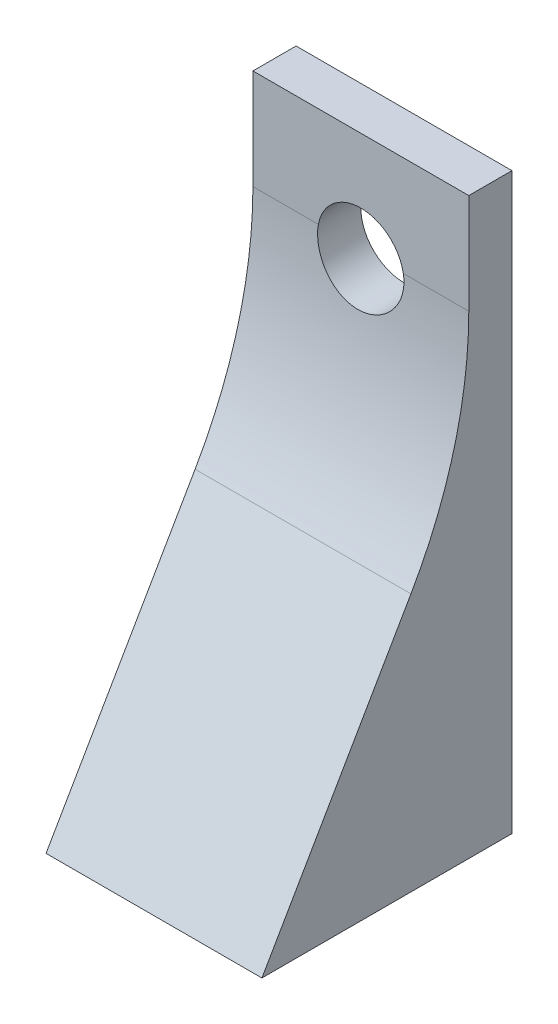
ISO-10303-21;
HEADER;
FILE_DESCRIPTION(('STEP AP214'),'2;1');
FILE_NAME('part.step','',(''),(''),'','','');
FILE_SCHEMA(('AUTOMOTIVE_DESIGN { 1 0 10303 214 1 1 1 1 }'));
ENDSEC;
DATA;
#1=APPLICATION_CONTEXT('core data for automotive mechanical design processes');
#2=APPLICATION_PROTOCOL_DEFINITION('international standard','automotive_design',2000,#1);
#3=PRODUCT_CONTEXT('',#1,'mechanical');
#4=PRODUCT('Part','Part','',(#3));
#5=PRODUCT_RELATED_PRODUCT_CATEGORY('part','',(#4));
#6=PRODUCT_DEFINITION_FORMATION('','',#4);
#7=PRODUCT_DEFINITION_CONTEXT('part definition',#1,'design');
#8=PRODUCT_DEFINITION('design','',#6,#7);
#9=PRODUCT_DEFINITION_SHAPE('','',#8);
#10=(LENGTH_UNIT() NAMED_UNIT(*) SI_UNIT(.MILLI.,.METRE.));
#11=(NAMED_UNIT(*) PLANE_ANGLE_UNIT() SI_UNIT($,.RADIAN.));
#12=(NAMED_UNIT(*) SI_UNIT($,.STERADIAN.) SOLID_ANGLE_UNIT());
#13=UNCERTAINTY_MEASURE_WITH_UNIT(LENGTH_MEASURE(1.E-05),#10,'distance_accuracy_value','');
#14=(GEOMETRIC_REPRESENTATION_CONTEXT(3) GLOBAL_UNCERTAINTY_ASSIGNED_CONTEXT((#13)) GLOBAL_UNIT_ASSIGNED_CONTEXT((#10,
#11,#12)) REPRESENTATION_CONTEXT('',''));
#15=CARTESIAN_POINT('',(0.,0.,0.));
#16=DIRECTION('',(0.,0.,1.));
#17=DIRECTION('',(1.,0.,0.));
#18=AXIS2_PLACEMENT_3D('',#15,#16,#17);
#19=CARTESIAN_POINT('',(0.,0.,1.));
#20=DIRECTION('',(0.,0.,1.));
#21=DIRECTION('',(1.,0.,0.));
#22=AXIS2_PLACEMENT_3D('',#19,#20,#21);
#23=PLANE('',#22);
#24=DIRECTION('',(0.,-1.,0.));
#25=VECTOR('',#24,1.);
#26=CARTESIAN_POINT('',(-2.5,6.65,1.));
#27=LINE('',#26,#25);
#28=CARTESIAN_POINT('',(-2.5,6.65,1.));
#29=VERTEX_POINT('',#28);
#30=CARTESIAN_POINT('',(-2.5,4.32949192431126,1.));
#31=VERTEX_POINT('',#30);
#32=EDGE_CURVE('E116',#29,#31,#27,.T.);
#33=ORIENTED_EDGE('',*,*,#32,.T.);
#34=DIRECTION('',(-1.,0.,0.));
#35=VECTOR('',#34,1.);
#36=CARTESIAN_POINT('',(0.,4.32949192431126,1.));
#37=LINE('',#36,#35);
#38=CARTESIAN_POINT('',(-0.983759446768897,4.32949192431126,1.));
#39=VERTEX_POINT('',#38);
#40=EDGE_CURVE('E51',#31,#39,#37,.F.);
#41=ORIENTED_EDGE('',*,*,#40,.T.);
#42=CARTESIAN_POINT('',(0.,4.15,1.));
#43=DIRECTION('',(0.,0.,1.));
#44=DIRECTION('',(1.,0.,0.));
#45=AXIS2_PLACEMENT_3D('',#42,#43,#44);
#46=CIRCLE('',#45,1.);
#47=CARTESIAN_POINT('',(0.983759446768894,4.32949192431126,1.));
#48=VERTEX_POINT('',#47);
#49=EDGE_CURVE('E124',#48,#39,#46,.T.);
#50=ORIENTED_EDGE('',*,*,#49,.F.);
#51=DIRECTION('',(-1.,0.,0.));
#52=VECTOR('',#51,1.);
#53=CARTESIAN_POINT('',(0.,4.32949192431126,1.));
#54=LINE('',#53,#52);
#55=CARTESIAN_POINT('',(2.5,4.32949192431126,1.));
#56=VERTEX_POINT('',#55);
#57=EDGE_CURVE('E150',#48,#56,#54,.F.);
#58=ORIENTED_EDGE('',*,*,#57,.T.);
#59=DIRECTION('',(0.,1.,0.));
#60=VECTOR('',#59,1.);
#61=CARTESIAN_POINT('',(2.5,6.65,1.));
#62=LINE('',#61,#60);
#63=CARTESIAN_POINT('',(2.5,6.65,1.));
#64=VERTEX_POINT('',#63);
#65=EDGE_CURVE('E130',#56,#64,#62,.T.);
#66=ORIENTED_EDGE('',*,*,#65,.T.);
#67=DIRECTION('',(-1.,0.,0.));
#68=VECTOR('',#67,1.);
#69=CARTESIAN_POINT('',(-2.5,6.65,1.));
#70=LINE('',#69,#68);
#71=EDGE_CURVE('E132',#64,#29,#70,.T.);
#72=ORIENTED_EDGE('',*,*,#71,.T.);
#73=EDGE_LOOP('',(#33,#41,#50,#58,#66,#72));
#74=FACE_BOUND('',#73,.T.);
#75=ADVANCED_FACE('F35',(#74),#23,.T.);
#76=CARTESIAN_POINT('',(0.,0.,0.));
#77=DIRECTION('',(0.,0.,1.));
#78=DIRECTION('',(1.,0.,0.));
#79=AXIS2_PLACEMENT_3D('',#76,#77,#78);
#80=PLANE('',#79);
#81=DIRECTION('',(0.,1.,0.));
#82=VECTOR('',#81,1.);
#83=CARTESIAN_POINT('',(2.5,6.65,0.));
#84=LINE('',#83,#82);
#85=CARTESIAN_POINT('',(2.5,-6.65,0.));
#86=VERTEX_POINT('',#85);
#87=CARTESIAN_POINT('',(2.5,6.65,0.));
#88=VERTEX_POINT('',#87);
#89=EDGE_CURVE('E128',#86,#88,#84,.T.);
#90=ORIENTED_EDGE('',*,*,#89,.F.);
#91=DIRECTION('',(1.,0.,0.));
#92=VECTOR('',#91,1.);
#93=CARTESIAN_POINT('',(-2.5,-6.65,0.));
#94=LINE('',#93,#92);
#95=CARTESIAN_POINT('',(-2.5,-6.65,0.));
#96=VERTEX_POINT('',#95);
#97=EDGE_CURVE('E114',#96,#86,#94,.T.);
#98=ORIENTED_EDGE('',*,*,#97,.F.);
#99=DIRECTION('',(0.,-1.,0.));
#100=VECTOR('',#99,1.);
#101=CARTESIAN_POINT('',(-2.5,6.65,0.));
#102=LINE('',#101,#100);
#103=CARTESIAN_POINT('',(-2.5,6.65,0.));
#104=VERTEX_POINT('',#103);
#105=EDGE_CURVE('E138',#104,#96,#102,.T.);
#106=ORIENTED_EDGE('',*,*,#105,.F.);
#107=DIRECTION('',(-1.,0.,0.));
#108=VECTOR('',#107,1.);
#109=CARTESIAN_POINT('',(-2.5,6.65,0.));
#110=LINE('',#109,#108);
#111=EDGE_CURVE('E136',#88,#104,#110,.T.);
#112=ORIENTED_EDGE('',*,*,#111,.F.);
#113=EDGE_LOOP('',(#90,#98,#106,#112));
#114=FACE_BOUND('',#113,.T.);
#115=CARTESIAN_POINT('',(0.,4.15,0.));
#116=DIRECTION('',(0.,0.,1.));
#117=DIRECTION('',(1.,0.,0.));
#118=AXIS2_PLACEMENT_3D('',#115,#116,#117);
#119=CIRCLE('',#118,1.);
#120=CARTESIAN_POINT('',(0.999999999999998,4.15,0.));
#121=VERTEX_POINT('',#120);
#122=EDGE_CURVE('E121',#121,#121,#119,.T.);
#123=ORIENTED_EDGE('',*,*,#122,.T.);
#124=EDGE_LOOP('',(#123));
#125=FACE_BOUND('',#124,.T.);
#126=ADVANCED_FACE('F165',(#114,#125),#80,.F.);
#127=CARTESIAN_POINT('',(2.5,6.65,1.));
#128=DIRECTION('',(-1.,0.,0.));
#129=DIRECTION('',(0.,-1.,0.));
#130=AXIS2_PLACEMENT_3D('',#127,#128,#129);
#131=PLANE('',#130);
#132=ORIENTED_EDGE('',*,*,#89,.T.);
#133=DIRECTION('',(0.,0.,-1.));
#134=VECTOR('',#133,1.);
#135=CARTESIAN_POINT('',(2.5,6.65,1.));
#136=LINE('',#135,#134);
#137=EDGE_CURVE('E145',#64,#88,#136,.T.);
#138=ORIENTED_EDGE('',*,*,#137,.F.);
#139=ORIENTED_EDGE('',*,*,#65,.F.);
#140=CARTESIAN_POINT('',(2.5,4.32949192431126,11.));
#141=DIRECTION('',(-1.,0.,0.));
#142=DIRECTION('',(0.,-1.,0.));
#143=AXIS2_PLACEMENT_3D('',#140,#141,#142);
#144=CIRCLE('',#143,10.);
#145=CARTESIAN_POINT('',(2.5,-0.670508075688783,2.33974596215564));
#146=VERTEX_POINT('',#145);
#147=EDGE_CURVE('E11',#56,#146,#144,.T.);
#148=ORIENTED_EDGE('',*,*,#147,.T.);
#149=DIRECTION('',(0.,-0.866025403784436,0.500000000000004));
#150=VECTOR('',#149,1.);
#151=CARTESIAN_POINT('',(2.5,1.65,1.));
#152=LINE('',#151,#150);
#153=CARTESIAN_POINT('',(2.5,-6.65,5.79200723427395));
#154=VERTEX_POINT('',#153);
#155=EDGE_CURVE('E94',#146,#154,#152,.T.);
#156=ORIENTED_EDGE('',*,*,#155,.T.);
#157=DIRECTION('',(0.,0.,-1.));
#158=VECTOR('',#157,1.);
#159=CARTESIAN_POINT('',(2.5,-6.65,1.));
#160=LINE('',#159,#158);
#161=EDGE_CURVE('E98',#154,#86,#160,.T.);
#162=ORIENTED_EDGE('',*,*,#161,.T.);
#163=EDGE_LOOP('',(#132,#138,#139,#148,#156,#162));
#164=FACE_BOUND('',#163,.T.);
#165=ADVANCED_FACE('F97',(#164),#131,.F.);
#166=CARTESIAN_POINT('',(-2.5,6.65,1.));
#167=DIRECTION('',(0.,-1.,0.));
#168=DIRECTION('',(0.,0.,-1.));
#169=AXIS2_PLACEMENT_3D('',#166,#167,#168);
#170=PLANE('',#169);
#171=ORIENTED_EDGE('',*,*,#111,.T.);
#172=DIRECTION('',(0.,0.,-1.));
#173=VECTOR('',#172,1.);
#174=CARTESIAN_POINT('',(-2.5,6.65,1.));
#175=LINE('',#174,#173);
#176=EDGE_CURVE('E142',#29,#104,#175,.T.);
#177=ORIENTED_EDGE('',*,*,#176,.F.);
#178=ORIENTED_EDGE('',*,*,#71,.F.);
#179=ORIENTED_EDGE('',*,*,#137,.T.);
#180=EDGE_LOOP('',(#171,#177,#178,#179));
#181=FACE_BOUND('',#180,.T.);
#182=ADVANCED_FACE('F174',(#181),#170,.F.);
#183=CARTESIAN_POINT('',(-2.5,6.65,1.));
#184=DIRECTION('',(1.,0.,0.));
#185=DIRECTION('',(0.,1.,0.));
#186=AXIS2_PLACEMENT_3D('',#183,#184,#185);
#187=PLANE('',#186);
#188=ORIENTED_EDGE('',*,*,#105,.T.);
#189=DIRECTION('',(0.,0.,-1.));
#190=VECTOR('',#189,1.);
#191=CARTESIAN_POINT('',(-2.5,-6.65,1.));
#192=LINE('',#191,#190);
#193=CARTESIAN_POINT('',(-2.5,-6.65,5.79200723427395));
#194=VERTEX_POINT('',#193);
#195=EDGE_CURVE('E115',#194,#96,#192,.T.);
#196=ORIENTED_EDGE('',*,*,#195,.F.);
#197=DIRECTION('',(0.,-0.866025403784436,0.500000000000004));
#198=VECTOR('',#197,1.);
#199=CARTESIAN_POINT('',(-2.5,1.65,1.));
#200=LINE('',#199,#198);
#201=CARTESIAN_POINT('',(-2.5,-0.670508075688783,2.33974596215564));
#202=VERTEX_POINT('',#201);
#203=EDGE_CURVE('E107',#202,#194,#200,.T.);
#204=ORIENTED_EDGE('',*,*,#203,.F.);
#205=CARTESIAN_POINT('',(-2.5,4.32949192431126,11.));
#206=DIRECTION('',(1.,0.,0.));
#207=DIRECTION('',(0.,1.,0.));
#208=AXIS2_PLACEMENT_3D('',#205,#206,#207);
#209=CIRCLE('',#208,10.);
#210=EDGE_CURVE('E153',#202,#31,#209,.T.);
#211=ORIENTED_EDGE('',*,*,#210,.T.);
#212=ORIENTED_EDGE('',*,*,#32,.F.);
#213=ORIENTED_EDGE('',*,*,#176,.T.);
#214=EDGE_LOOP('',(#188,#196,#204,#211,#212,#213));
#215=FACE_BOUND('',#214,.T.);
#216=ADVANCED_FACE('F171',(#215),#187,.F.);
#217=CARTESIAN_POINT('',(-2.5,-6.65,1.));
#218=DIRECTION('',(0.,1.,0.));
#219=DIRECTION('',(0.,0.,1.));
#220=AXIS2_PLACEMENT_3D('',#217,#218,#219);
#221=PLANE('',#220);
#222=ORIENTED_EDGE('',*,*,#97,.T.);
#223=ORIENTED_EDGE('',*,*,#161,.F.);
#224=DIRECTION('',(-1.,0.,0.));
#225=VECTOR('',#224,1.);
#226=CARTESIAN_POINT('',(2.5,-6.65,5.79200723427395));
#227=LINE('',#226,#225);
#228=EDGE_CURVE('E106',#154,#194,#227,.T.);
#229=ORIENTED_EDGE('',*,*,#228,.T.);
#230=ORIENTED_EDGE('',*,*,#195,.T.);
#231=EDGE_LOOP('',(#222,#223,#229,#230));
#232=FACE_BOUND('',#231,.T.);
#233=ADVANCED_FACE('F111',(#232),#221,.F.);
#234=CARTESIAN_POINT('',(0.,4.15,1.));
#235=DIRECTION('',(0.,0.,-1.));
#236=DIRECTION('',(-1.,0.,0.));
#237=AXIS2_PLACEMENT_3D('',#234,#235,#236);
#238=CYLINDRICAL_SURFACE('',#237,1.);
#239=ORIENTED_EDGE('',*,*,#49,.T.);
#240=CARTESIAN_POINT('',(-0.983759446768897,4.32949192431126,1.));
#241=CARTESIAN_POINT('',(-0.988792162442098,4.30190801619839,0.999999383056627));
#242=CARTESIAN_POINT('',(-0.992661798530746,4.27412553559646,1.00011429047442));
#243=CARTESIAN_POINT('',(-0.998056158490651,4.2183374881265,1.0005789511635));
#244=CARTESIAN_POINT('',(-0.999581020710598,4.19033193451847,1.00092869057725));
#245=CARTESIAN_POINT('',(-1.00060976660735,4.10633805555547,1.00233417731669));
#246=CARTESIAN_POINT('',(-0.996586107977379,4.05027162274868,1.00374616498933));
#247=CARTESIAN_POINT('',(-0.979228314208899,3.93963585351766,1.00744854768485));
#248=CARTESIAN_POINT('',(-0.965890373964052,3.88506713841909,1.00973930153226));
#249=CARTESIAN_POINT('',(-0.930299138806153,3.77895697196549,1.01502465164254));
#250=CARTESIAN_POINT('',(-0.908046993217681,3.72741513133197,1.01801915714887));
#251=CARTESIAN_POINT('',(-0.855185130424568,3.62865027913524,1.02446587762939));
#252=CARTESIAN_POINT('',(-0.824551058126304,3.58144039705001,1.02791941111135));
#253=CARTESIAN_POINT('',(-0.755812152853713,3.49281406596373,1.0349636264068));
#254=CARTESIAN_POINT('',(-0.717706028020382,3.45139862089987,1.03855433184968));
#255=CARTESIAN_POINT('',(-0.634909804460206,3.37536329040734,1.04554842924729));
#256=CARTESIAN_POINT('',(-0.590192371369666,3.34077308072337,1.0489509588438));
#257=CARTESIAN_POINT('',(-0.495551607718661,3.27959600389373,1.0552190798896));
#258=CARTESIAN_POINT('',(-0.445628657542935,3.2530085525105,1.05808471052919));
#259=CARTESIAN_POINT('',(-0.342086611350734,3.20864853390952,1.0629878764861));
#260=CARTESIAN_POINT('',(-0.288474998216693,3.19085868725999,1.06502703365168));
#261=CARTESIAN_POINT('',(-0.178995970410152,3.16454086701738,1.06807840770534));
#262=CARTESIAN_POINT('',(-0.1231286088107,3.15601267564846,1.06909064873998));
#263=CARTESIAN_POINT('',(-0.011096244391044,3.14849645509603,1.0699816589431));
#264=CARTESIAN_POINT('',(0.0450647579905221,3.14944953311099,1.06986742523587));
#265=CARTESIAN_POINT('',(0.156423583622326,3.16072573888002,1.06853399165544));
#266=CARTESIAN_POINT('',(0.211621421908913,3.17104872022305,1.06731480904782));
#267=CARTESIAN_POINT('',(0.319388842694319,3.20073238438414,1.06389802071067));
#268=CARTESIAN_POINT('',(0.3719630271545,3.22007657925769,1.06170220030566));
#269=CARTESIAN_POINT('',(0.473122538361272,3.26723746146175,1.05655113979342));
#270=CARTESIAN_POINT('',(0.521707737508908,3.29505441968357,1.05359587540571));
#271=CARTESIAN_POINT('',(0.613782012562444,3.35853642413171,1.04719813823361));
#272=CARTESIAN_POINT('',(0.65724363913721,3.39424103630985,1.04375324158915));
#273=CARTESIAN_POINT('',(0.737573664838827,3.47241159179129,1.03671993674419));
#274=CARTESIAN_POINT('',(0.774442046751323,3.51487755274731,1.03313152816902));
#275=CARTESIAN_POINT('',(0.840719319724153,3.60560821105792,1.02613068060663));
#276=CARTESIAN_POINT('',(0.87009154160011,3.65389977371562,1.02271916933228));
#277=CARTESIAN_POINT('',(0.920311077167752,3.75477623218171,1.01640083261238));
#278=CARTESIAN_POINT('',(0.941156512976513,3.80736207067718,1.01349411842101));
#279=CARTESIAN_POINT('',(0.973686617542049,3.91525089701079,1.00843766725719));
#280=CARTESIAN_POINT('',(0.985382520409027,3.97055046385313,1.00628700377287));
#281=CARTESIAN_POINT('',(0.999290780354738,4.0823222258019,1.00289937372051));
#282=CARTESIAN_POINT('',(1.00151506130819,4.13879285655018,1.0016612599644));
#283=CARTESIAN_POINT('',(0.997971832313432,4.21757013956021,1.00060054327547));
#284=CARTESIAN_POINT('',(0.996188965200307,4.24010669293081,1.000374231141));
#285=CARTESIAN_POINT('',(0.99110601356176,4.2849681239453,1.00007406445386));
#286=CARTESIAN_POINT('',(0.987808658851896,4.30729330899093,0.999999936902738));
#287=CARTESIAN_POINT('',(0.983759446768899,4.32949192431126,0.999999999999999));
#288=B_SPLINE_CURVE_WITH_KNOTS('',3,(#240,#241,#242,#243,#244,#245,#246,#247,#248,#249,#250,
#251,#252,#253,#254,#255,#256,#257,#258,#259,#260,#261,#262,#263,#264,#265,#266,#267,#268,#269,
#270,#271,#272,#273,#274,#275,#276,#277,#278,#279,#280,#281,#282,#283,#284,#285,#286,#287),
.UNSPECIFIED.,.F.,.F.,(4,2,2,2,2,2,2,2,2,2,2,2,2,2,2,2,2,2,2,2,2,2,2,4),(0.,0.0840660719751538,
0.168127183609629,0.335945728778246,0.50383287196484,0.671698376122222,0.840056918652149,
1.00844459475328,1.1775490150871,1.3466410870373,1.51539971188585,1.68415436850764,
1.85186146517872,2.01956594135891,2.18696510052047,2.35436961233212,2.52263373532608,
2.69089829763578,2.85997083522914,3.02908058821729,3.19798237512361,3.36667146770251,
3.43445399120071,3.50211481544653),.UNSPECIFIED.);
#289=EDGE_CURVE('E44',#39,#48,#288,.T.);
#290=ORIENTED_EDGE('',*,*,#289,.T.);
#291=EDGE_LOOP('',(#239,#290));
#292=FACE_BOUND('',#291,.T.);
#293=ORIENTED_EDGE('',*,*,#122,.F.);
#294=EDGE_LOOP('',(#293));
#295=FACE_BOUND('',#294,.T.);
#296=ADVANCED_FACE('F158',(#292,#295),#238,.F.);
#297=CARTESIAN_POINT('',(2.5,1.65,1.));
#298=DIRECTION('',(0.,-0.500000000000004,-0.866025403784436));
#299=DIRECTION('',(0.,0.866025403784436,-0.500000000000004));
#300=AXIS2_PLACEMENT_3D('',#297,#298,#299);
#301=PLANE('',#300);
#302=ORIENTED_EDGE('',*,*,#155,.F.);
#303=DIRECTION('',(-1.,0.,0.));
#304=VECTOR('',#303,1.);
#305=CARTESIAN_POINT('',(2.5,-0.670508075688783,2.33974596215564));
#306=LINE('',#305,#304);
#307=EDGE_CURVE('E148',#146,#202,#306,.T.);
#308=ORIENTED_EDGE('',*,*,#307,.T.);
#309=ORIENTED_EDGE('',*,*,#203,.T.);
#310=ORIENTED_EDGE('',*,*,#228,.F.);
#311=EDGE_LOOP('',(#302,#308,#309,#310));
#312=FACE_BOUND('',#311,.T.);
#313=ADVANCED_FACE('F118',(#312),#301,.F.);
#314=CARTESIAN_POINT('',(2.5,4.32949192431126,11.));
#315=DIRECTION('',(-1.,0.,0.));
#316=DIRECTION('',(0.,0.,1.));
#317=AXIS2_PLACEMENT_3D('',#314,#315,#316);
#318=CYLINDRICAL_SURFACE('',#317,10.);
#319=ORIENTED_EDGE('',*,*,#289,.F.);
#320=ORIENTED_EDGE('',*,*,#40,.F.);
#321=ORIENTED_EDGE('',*,*,#210,.F.);
#322=ORIENTED_EDGE('',*,*,#307,.F.);
#323=ORIENTED_EDGE('',*,*,#147,.F.);
#324=ORIENTED_EDGE('',*,*,#57,.F.);
#325=EDGE_LOOP('',(#319,#320,#321,#322,#323,#324));
#326=FACE_BOUND('',#325,.T.);
#327=ADVANCED_FACE('F37',(#326),#318,.F.);
#328=CLOSED_SHELL('',(#75,#126,#165,#182,#216,#233,#296,#313,#327));
#329=MANIFOLD_SOLID_BREP('B2',#328);
#330=ADVANCED_BREP_SHAPE_REPRESENTATION('',(#18,#329),#14);
#331=SHAPE_DEFINITION_REPRESENTATION(#9,#330);
ENDSEC;
END-ISO-10303-21;
